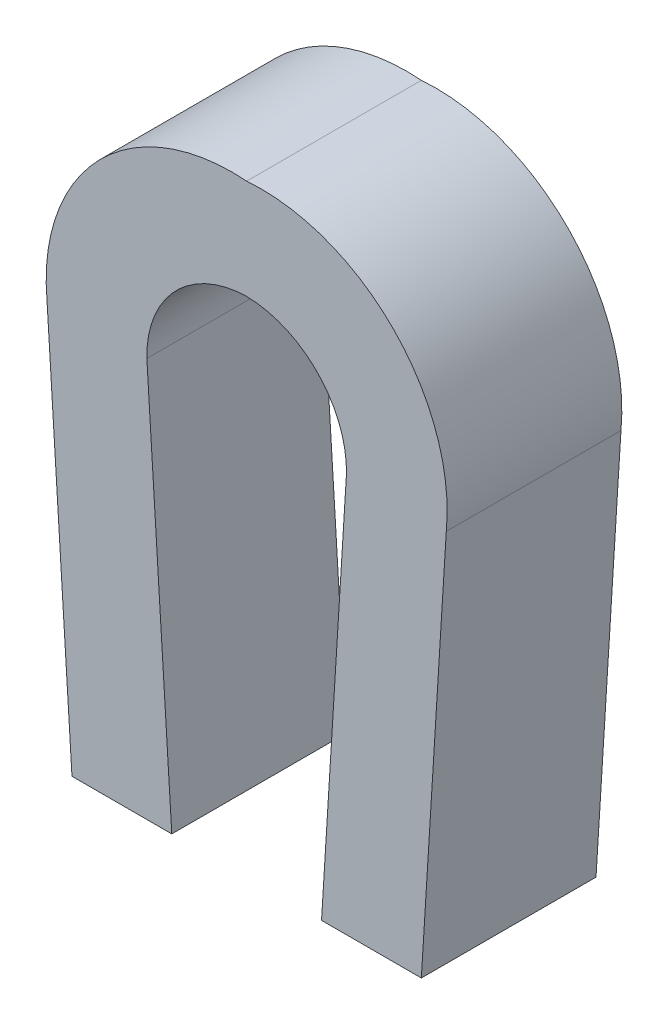
ISO-10303-21;
HEADER;
FILE_DESCRIPTION(('STEP AP214'),'2;1');
FILE_NAME('part.step','',(''),(''),'','','');
FILE_SCHEMA(('AUTOMOTIVE_DESIGN { 1 0 10303 214 1 1 1 1 }'));
ENDSEC;
DATA;
#1=APPLICATION_CONTEXT('core data for automotive mechanical design processes');
#2=APPLICATION_PROTOCOL_DEFINITION('international standard','automotive_design',2000,#1);
#3=PRODUCT_CONTEXT('',#1,'mechanical');
#4=PRODUCT('Part','Part','',(#3));
#5=PRODUCT_RELATED_PRODUCT_CATEGORY('part','',(#4));
#6=PRODUCT_DEFINITION_FORMATION('','',#4);
#7=PRODUCT_DEFINITION_CONTEXT('part definition',#1,'design');
#8=PRODUCT_DEFINITION('design','',#6,#7);
#9=PRODUCT_DEFINITION_SHAPE('','',#8);
#10=(LENGTH_UNIT() NAMED_UNIT(*) SI_UNIT(.MILLI.,.METRE.));
#11=(NAMED_UNIT(*) PLANE_ANGLE_UNIT() SI_UNIT($,.RADIAN.));
#12=(NAMED_UNIT(*) SI_UNIT($,.STERADIAN.) SOLID_ANGLE_UNIT());
#13=UNCERTAINTY_MEASURE_WITH_UNIT(LENGTH_MEASURE(1.E-05),#10,'distance_accuracy_value','');
#14=(GEOMETRIC_REPRESENTATION_CONTEXT(3) GLOBAL_UNCERTAINTY_ASSIGNED_CONTEXT((#13)) GLOBAL_UNIT_ASSIGNED_CONTEXT((#10,
#11,#12)) REPRESENTATION_CONTEXT('',''));
#15=CARTESIAN_POINT('',(0.,0.,0.));
#16=DIRECTION('',(0.,0.,1.));
#17=DIRECTION('',(1.,0.,0.));
#18=AXIS2_PLACEMENT_3D('',#15,#16,#17);
#19=CARTESIAN_POINT('',(0.0360134835005064,4.04110421672633,3.5));
#20=DIRECTION('',(0.,0.,-1.));
#21=DIRECTION('',(-1.,0.,0.));
#22=AXIS2_PLACEMENT_3D('',#19,#20,#21);
#23=CYLINDRICAL_SURFACE('',#22,2.03642835907099);
#24=CARTESIAN_POINT('',(0.0360134835005064,4.04110421672633,0.));
#25=DIRECTION('',(0.,0.,-1.));
#26=DIRECTION('',(-1.,0.,0.));
#27=AXIS2_PLACEMENT_3D('',#24,#25,#26);
#28=CIRCLE('',#27,2.03642835907099);
#29=CARTESIAN_POINT('',(-2.,4.,0.));
#30=VERTEX_POINT('',#29);
#31=CARTESIAN_POINT('',(0.,6.07721410831733,0.));
#32=VERTEX_POINT('',#31);
#33=EDGE_CURVE('E141',#30,#32,#28,.T.);
#34=ORIENTED_EDGE('',*,*,#33,.T.);
#35=DIRECTION('',(0.,0.,-1.));
#36=VECTOR('',#35,1.);
#37=CARTESIAN_POINT('',(0.,6.07721410831733,3.5));
#38=LINE('',#37,#36);
#39=CARTESIAN_POINT('',(0.,6.07721410831733,3.5));
#40=VERTEX_POINT('',#39);
#41=EDGE_CURVE('E11',#40,#32,#38,.T.);
#42=ORIENTED_EDGE('',*,*,#41,.F.);
#43=CARTESIAN_POINT('',(0.0360134835005064,4.04110421672633,3.5));
#44=DIRECTION('',(0.,0.,-1.));
#45=DIRECTION('',(-1.,0.,0.));
#46=AXIS2_PLACEMENT_3D('',#43,#44,#45);
#47=CIRCLE('',#46,2.03642835907099);
#48=CARTESIAN_POINT('',(-2.,4.,3.5));
#49=VERTEX_POINT('',#48);
#50=EDGE_CURVE('E159',#49,#40,#47,.T.);
#51=ORIENTED_EDGE('',*,*,#50,.F.);
#52=DIRECTION('',(0.,0.,-1.));
#53=VECTOR('',#52,1.);
#54=CARTESIAN_POINT('',(-2.,4.,3.5));
#55=LINE('',#54,#53);
#56=EDGE_CURVE('E137',#49,#30,#55,.T.);
#57=ORIENTED_EDGE('',*,*,#56,.T.);
#58=EDGE_LOOP('',(#34,#42,#51,#57));
#59=FACE_BOUND('',#58,.T.);
#60=ADVANCED_FACE('F33',(#59),#23,.F.);
#61=CARTESIAN_POINT('',(-0.0360134835005055,4.04110421672633,3.5));
#62=DIRECTION('',(0.,0.,-1.));
#63=DIRECTION('',(-1.,0.,0.));
#64=AXIS2_PLACEMENT_3D('',#61,#62,#63);
#65=CYLINDRICAL_SURFACE('',#64,2.03642835907099);
#66=CARTESIAN_POINT('',(-0.0360134835005055,4.04110421672633,0.));
#67=DIRECTION('',(0.,0.,-1.));
#68=DIRECTION('',(1.,0.,0.));
#69=AXIS2_PLACEMENT_3D('',#66,#67,#68);
#70=CIRCLE('',#69,2.03642835907099);
#71=CARTESIAN_POINT('',(2.,4.,0.));
#72=VERTEX_POINT('',#71);
#73=EDGE_CURVE('E144',#32,#72,#70,.T.);
#74=ORIENTED_EDGE('',*,*,#73,.T.);
#75=DIRECTION('',(0.,0.,-1.));
#76=VECTOR('',#75,1.);
#77=CARTESIAN_POINT('',(2.,4.,3.5));
#78=LINE('',#77,#76);
#79=CARTESIAN_POINT('',(2.,4.,3.5));
#80=VERTEX_POINT('',#79);
#81=EDGE_CURVE('E41',#80,#72,#78,.T.);
#82=ORIENTED_EDGE('',*,*,#81,.F.);
#83=CARTESIAN_POINT('',(-0.0360134835005055,4.04110421672633,3.5));
#84=DIRECTION('',(0.,0.,-1.));
#85=DIRECTION('',(1.,0.,0.));
#86=AXIS2_PLACEMENT_3D('',#83,#84,#85);
#87=CIRCLE('',#86,2.03642835907099);
#88=EDGE_CURVE('E98',#40,#80,#87,.T.);
#89=ORIENTED_EDGE('',*,*,#88,.F.);
#90=ORIENTED_EDGE('',*,*,#41,.T.);
#91=EDGE_LOOP('',(#74,#82,#89,#90));
#92=FACE_BOUND('',#91,.T.);
#93=ADVANCED_FACE('F208',(#92),#65,.F.);
#94=CARTESIAN_POINT('',(2.,4.,3.5));
#95=DIRECTION('',(0.998052578482889,-0.0623782861551804,0.));
#96=DIRECTION('',(0.0623782861551804,0.998052578482889,0.));
#97=AXIS2_PLACEMENT_3D('',#94,#95,#96);
#98=PLANE('',#97);
#99=DIRECTION('',(-0.0623782861551804,-0.998052578482889,0.));
#100=VECTOR('',#99,1.);
#101=CARTESIAN_POINT('',(2.,4.,0.));
#102=LINE('',#101,#100);
#103=CARTESIAN_POINT('',(1.5,-4.,0.));
#104=VERTEX_POINT('',#103);
#105=EDGE_CURVE('E146',#72,#104,#102,.T.);
#106=ORIENTED_EDGE('',*,*,#105,.T.);
#107=DIRECTION('',(0.,0.,-1.));
#108=VECTOR('',#107,1.);
#109=CARTESIAN_POINT('',(1.5,-4.,3.5));
#110=LINE('',#109,#108);
#111=CARTESIAN_POINT('',(1.5,-4.,3.5));
#112=VERTEX_POINT('',#111);
#113=EDGE_CURVE('E172',#112,#104,#110,.T.);
#114=ORIENTED_EDGE('',*,*,#113,.F.);
#115=DIRECTION('',(-0.0623782861551804,-0.998052578482889,0.));
#116=VECTOR('',#115,1.);
#117=CARTESIAN_POINT('',(2.,4.,3.5));
#118=LINE('',#117,#116);
#119=EDGE_CURVE('E180',#80,#112,#118,.T.);
#120=ORIENTED_EDGE('',*,*,#119,.F.);
#121=ORIENTED_EDGE('',*,*,#81,.T.);
#122=EDGE_LOOP('',(#106,#114,#120,#121));
#123=FACE_BOUND('',#122,.T.);
#124=ADVANCED_FACE('F178',(#123),#98,.F.);
#125=CARTESIAN_POINT('',(1.5,-4.,3.5));
#126=DIRECTION('',(0.,1.,0.));
#127=DIRECTION('',(-1.,0.,0.));
#128=AXIS2_PLACEMENT_3D('',#125,#126,#127);
#129=PLANE('',#128);
#130=DIRECTION('',(1.,0.,0.));
#131=VECTOR('',#130,1.);
#132=CARTESIAN_POINT('',(1.5,-4.,0.));
#133=LINE('',#132,#131);
#134=CARTESIAN_POINT('',(3.5,-4.,0.));
#135=VERTEX_POINT('',#134);
#136=EDGE_CURVE('E148',#104,#135,#133,.T.);
#137=ORIENTED_EDGE('',*,*,#136,.T.);
#138=DIRECTION('',(0.,0.,-1.));
#139=VECTOR('',#138,1.);
#140=CARTESIAN_POINT('',(3.5,-4.,3.5));
#141=LINE('',#140,#139);
#142=CARTESIAN_POINT('',(3.5,-4.,3.5));
#143=VERTEX_POINT('',#142);
#144=EDGE_CURVE('E169',#143,#135,#141,.T.);
#145=ORIENTED_EDGE('',*,*,#144,.F.);
#146=DIRECTION('',(1.,0.,0.));
#147=VECTOR('',#146,1.);
#148=CARTESIAN_POINT('',(1.5,-4.,3.5));
#149=LINE('',#148,#147);
#150=EDGE_CURVE('E198',#112,#143,#149,.T.);
#151=ORIENTED_EDGE('',*,*,#150,.F.);
#152=ORIENTED_EDGE('',*,*,#113,.T.);
#153=EDGE_LOOP('',(#137,#145,#151,#152));
#154=FACE_BOUND('',#153,.T.);
#155=ADVANCED_FACE('F189',(#154),#129,.F.);
#156=CARTESIAN_POINT('',(3.5,-4.,3.5));
#157=DIRECTION('',(-0.998052578482889,0.0623782861551807,0.));
#158=DIRECTION('',(-0.0623782861551807,-0.998052578482889,0.));
#159=AXIS2_PLACEMENT_3D('',#156,#157,#158);
#160=PLANE('',#159);
#161=DIRECTION('',(0.0623782861551807,0.998052578482889,0.));
#162=VECTOR('',#161,1.);
#163=CARTESIAN_POINT('',(3.5,-4.,0.));
#164=LINE('',#163,#162);
#165=CARTESIAN_POINT('',(4.,4.,0.));
#166=VERTEX_POINT('',#165);
#167=EDGE_CURVE('E150',#135,#166,#164,.T.);
#168=ORIENTED_EDGE('',*,*,#167,.T.);
#169=DIRECTION('',(0.,0.,-1.));
#170=VECTOR('',#169,1.);
#171=CARTESIAN_POINT('',(4.,4.,3.5));
#172=LINE('',#171,#170);
#173=CARTESIAN_POINT('',(4.,4.,3.5));
#174=VERTEX_POINT('',#173);
#175=EDGE_CURVE('E166',#174,#166,#172,.T.);
#176=ORIENTED_EDGE('',*,*,#175,.F.);
#177=DIRECTION('',(0.0623782861551807,0.998052578482889,0.));
#178=VECTOR('',#177,1.);
#179=CARTESIAN_POINT('',(3.5,-4.,3.5));
#180=LINE('',#179,#178);
#181=EDGE_CURVE('E195',#143,#174,#180,.T.);
#182=ORIENTED_EDGE('',*,*,#181,.F.);
#183=ORIENTED_EDGE('',*,*,#144,.T.);
#184=EDGE_LOOP('',(#168,#176,#182,#183));
#185=FACE_BOUND('',#184,.T.);
#186=ADVANCED_FACE('F193',(#185),#160,.F.);
#187=CARTESIAN_POINT('',(0.288890432809215,4.35990240757147,3.5));
#188=DIRECTION('',(0.,0.,-1.));
#189=DIRECTION('',(-1.,0.,0.));
#190=AXIS2_PLACEMENT_3D('',#187,#188,#189);
#191=CYLINDRICAL_SURFACE('',#190,3.72852034494526);
#192=CARTESIAN_POINT('',(0.288890432809215,4.35990240757147,0.));
#193=DIRECTION('',(0.,0.,1.));
#194=DIRECTION('',(1.,0.,0.));
#195=AXIS2_PLACEMENT_3D('',#192,#193,#194);
#196=CIRCLE('',#195,3.72852034494526);
#197=CARTESIAN_POINT('',(0.,8.07721410831733,0.));
#198=VERTEX_POINT('',#197);
#199=EDGE_CURVE('E152',#166,#198,#196,.T.);
#200=ORIENTED_EDGE('',*,*,#199,.T.);
#201=DIRECTION('',(0.,0.,-1.));
#202=VECTOR('',#201,1.);
#203=CARTESIAN_POINT('',(0.,8.07721410831733,3.5));
#204=LINE('',#203,#202);
#205=CARTESIAN_POINT('',(0.,8.07721410831733,3.5));
#206=VERTEX_POINT('',#205);
#207=EDGE_CURVE('E163',#206,#198,#204,.T.);
#208=ORIENTED_EDGE('',*,*,#207,.F.);
#209=CARTESIAN_POINT('',(0.288890432809215,4.35990240757147,3.5));
#210=DIRECTION('',(0.,0.,1.));
#211=DIRECTION('',(1.,0.,0.));
#212=AXIS2_PLACEMENT_3D('',#209,#210,#211);
#213=CIRCLE('',#212,3.72852034494526);
#214=EDGE_CURVE('E197',#174,#206,#213,.T.);
#215=ORIENTED_EDGE('',*,*,#214,.F.);
#216=ORIENTED_EDGE('',*,*,#175,.T.);
#217=EDGE_LOOP('',(#200,#208,#215,#216));
#218=FACE_BOUND('',#217,.T.);
#219=ADVANCED_FACE('F220',(#218),#191,.T.);
#220=CARTESIAN_POINT('',(-0.288890432809214,4.35990240757147,3.5));
#221=DIRECTION('',(0.,0.,-1.));
#222=DIRECTION('',(-1.,0.,0.));
#223=AXIS2_PLACEMENT_3D('',#220,#221,#222);
#224=CYLINDRICAL_SURFACE('',#223,3.72852034494526);
#225=CARTESIAN_POINT('',(-0.288890432809214,4.35990240757147,0.));
#226=DIRECTION('',(0.,0.,1.));
#227=DIRECTION('',(-1.,0.,0.));
#228=AXIS2_PLACEMENT_3D('',#225,#226,#227);
#229=CIRCLE('',#228,3.72852034494526);
#230=CARTESIAN_POINT('',(-4.,4.,0.));
#231=VERTEX_POINT('',#230);
#232=EDGE_CURVE('E154',#198,#231,#229,.T.);
#233=ORIENTED_EDGE('',*,*,#232,.T.);
#234=DIRECTION('',(0.,0.,-1.));
#235=VECTOR('',#234,1.);
#236=CARTESIAN_POINT('',(-4.,4.,3.5));
#237=LINE('',#236,#235);
#238=CARTESIAN_POINT('',(-4.,4.,3.5));
#239=VERTEX_POINT('',#238);
#240=EDGE_CURVE('E132',#239,#231,#237,.T.);
#241=ORIENTED_EDGE('',*,*,#240,.F.);
#242=CARTESIAN_POINT('',(-0.288890432809214,4.35990240757147,3.5));
#243=DIRECTION('',(0.,0.,1.));
#244=DIRECTION('',(-1.,0.,0.));
#245=AXIS2_PLACEMENT_3D('',#242,#243,#244);
#246=CIRCLE('',#245,3.72852034494526);
#247=EDGE_CURVE('E123',#206,#239,#246,.T.);
#248=ORIENTED_EDGE('',*,*,#247,.F.);
#249=ORIENTED_EDGE('',*,*,#207,.T.);
#250=EDGE_LOOP('',(#233,#241,#248,#249));
#251=FACE_BOUND('',#250,.T.);
#252=ADVANCED_FACE('F223',(#251),#224,.T.);
#253=CARTESIAN_POINT('',(-3.5,-4.,3.5));
#254=DIRECTION('',(0.998052578482889,0.0623782861551808,0.));
#255=DIRECTION('',(-0.0623782861551808,0.998052578482889,0.));
#256=AXIS2_PLACEMENT_3D('',#253,#254,#255);
#257=PLANE('',#256);
#258=DIRECTION('',(0.0623782861551808,-0.998052578482889,0.));
#259=VECTOR('',#258,1.);
#260=CARTESIAN_POINT('',(-3.5,-4.,0.));
#261=LINE('',#260,#259);
#262=CARTESIAN_POINT('',(-3.5,-4.,0.));
#263=VERTEX_POINT('',#262);
#264=EDGE_CURVE('E131',#231,#263,#261,.T.);
#265=ORIENTED_EDGE('',*,*,#264,.T.);
#266=DIRECTION('',(0.,0.,-1.));
#267=VECTOR('',#266,1.);
#268=CARTESIAN_POINT('',(-3.5,-4.,3.5));
#269=LINE('',#268,#267);
#270=CARTESIAN_POINT('',(-3.5,-4.,3.5));
#271=VERTEX_POINT('',#270);
#272=EDGE_CURVE('E128',#271,#263,#269,.T.);
#273=ORIENTED_EDGE('',*,*,#272,.F.);
#274=DIRECTION('',(0.0623782861551808,-0.998052578482889,0.));
#275=VECTOR('',#274,1.);
#276=CARTESIAN_POINT('',(-3.5,-4.,3.5));
#277=LINE('',#276,#275);
#278=EDGE_CURVE('E117',#239,#271,#277,.T.);
#279=ORIENTED_EDGE('',*,*,#278,.F.);
#280=ORIENTED_EDGE('',*,*,#240,.T.);
#281=EDGE_LOOP('',(#265,#273,#279,#280));
#282=FACE_BOUND('',#281,.T.);
#283=ADVANCED_FACE('F129',(#282),#257,.F.);
#284=CARTESIAN_POINT('',(-1.5,-4.,3.5));
#285=DIRECTION('',(0.,1.,0.));
#286=DIRECTION('',(-1.,0.,0.));
#287=AXIS2_PLACEMENT_3D('',#284,#285,#286);
#288=PLANE('',#287);
#289=DIRECTION('',(1.,0.,0.));
#290=VECTOR('',#289,1.);
#291=CARTESIAN_POINT('',(-1.5,-4.,0.));
#292=LINE('',#291,#290);
#293=CARTESIAN_POINT('',(-1.5,-4.,0.));
#294=VERTEX_POINT('',#293);
#295=EDGE_CURVE('E84',#263,#294,#292,.T.);
#296=ORIENTED_EDGE('',*,*,#295,.T.);
#297=DIRECTION('',(0.,0.,-1.));
#298=VECTOR('',#297,1.);
#299=CARTESIAN_POINT('',(-1.5,-4.,3.5));
#300=LINE('',#299,#298);
#301=CARTESIAN_POINT('',(-1.5,-4.,3.5));
#302=VERTEX_POINT('',#301);
#303=EDGE_CURVE('E133',#302,#294,#300,.T.);
#304=ORIENTED_EDGE('',*,*,#303,.F.);
#305=DIRECTION('',(1.,0.,0.));
#306=VECTOR('',#305,1.);
#307=CARTESIAN_POINT('',(-1.5,-4.,3.5));
#308=LINE('',#307,#306);
#309=EDGE_CURVE('E121',#271,#302,#308,.T.);
#310=ORIENTED_EDGE('',*,*,#309,.F.);
#311=ORIENTED_EDGE('',*,*,#272,.T.);
#312=EDGE_LOOP('',(#296,#304,#310,#311));
#313=FACE_BOUND('',#312,.T.);
#314=ADVANCED_FACE('F135',(#313),#288,.F.);
#315=CARTESIAN_POINT('',(-2.,4.,3.5));
#316=DIRECTION('',(-0.998052578482889,-0.0623782861551807,0.));
#317=DIRECTION('',(0.0623782861551807,-0.998052578482889,0.));
#318=AXIS2_PLACEMENT_3D('',#315,#316,#317);
#319=PLANE('',#318);
#320=DIRECTION('',(-0.0623782861551807,0.998052578482889,0.));
#321=VECTOR('',#320,1.);
#322=CARTESIAN_POINT('',(-2.,4.,0.));
#323=LINE('',#322,#321);
#324=EDGE_CURVE('E90',#294,#30,#323,.T.);
#325=ORIENTED_EDGE('',*,*,#324,.T.);
#326=ORIENTED_EDGE('',*,*,#56,.F.);
#327=DIRECTION('',(-0.0623782861551807,0.998052578482889,0.));
#328=VECTOR('',#327,1.);
#329=CARTESIAN_POINT('',(-2.,4.,3.5));
#330=LINE('',#329,#328);
#331=EDGE_CURVE('E49',#302,#49,#330,.T.);
#332=ORIENTED_EDGE('',*,*,#331,.F.);
#333=ORIENTED_EDGE('',*,*,#303,.T.);
#334=EDGE_LOOP('',(#325,#326,#332,#333));
#335=FACE_BOUND('',#334,.T.);
#336=ADVANCED_FACE('F232',(#335),#319,.F.);
#337=CARTESIAN_POINT('',(0.0360134835005064,4.04110421672633,3.5));
#338=DIRECTION('',(0.,0.,-1.));
#339=DIRECTION('',(-1.,0.,0.));
#340=AXIS2_PLACEMENT_3D('',#337,#338,#339);
#341=PLANE('',#340);
#342=ORIENTED_EDGE('',*,*,#50,.T.);
#343=ORIENTED_EDGE('',*,*,#88,.T.);
#344=ORIENTED_EDGE('',*,*,#119,.T.);
#345=ORIENTED_EDGE('',*,*,#150,.T.);
#346=ORIENTED_EDGE('',*,*,#181,.T.);
#347=ORIENTED_EDGE('',*,*,#214,.T.);
#348=ORIENTED_EDGE('',*,*,#247,.T.);
#349=ORIENTED_EDGE('',*,*,#278,.T.);
#350=ORIENTED_EDGE('',*,*,#309,.T.);
#351=ORIENTED_EDGE('',*,*,#331,.T.);
#352=EDGE_LOOP('',(#342,#343,#344,#345,#346,#347,#348,#349,#350,#351));
#353=FACE_BOUND('',#352,.T.);
#354=ADVANCED_FACE('F119',(#353),#341,.F.);
#355=CARTESIAN_POINT('',(0.0360134835005064,4.04110421672633,0.));
#356=DIRECTION('',(0.,0.,-1.));
#357=DIRECTION('',(-1.,0.,0.));
#358=AXIS2_PLACEMENT_3D('',#355,#356,#357);
#359=PLANE('',#358);
#360=ORIENTED_EDGE('',*,*,#33,.F.);
#361=ORIENTED_EDGE('',*,*,#324,.F.);
#362=ORIENTED_EDGE('',*,*,#295,.F.);
#363=ORIENTED_EDGE('',*,*,#264,.F.);
#364=ORIENTED_EDGE('',*,*,#232,.F.);
#365=ORIENTED_EDGE('',*,*,#199,.F.);
#366=ORIENTED_EDGE('',*,*,#167,.F.);
#367=ORIENTED_EDGE('',*,*,#136,.F.);
#368=ORIENTED_EDGE('',*,*,#105,.F.);
#369=ORIENTED_EDGE('',*,*,#73,.F.);
#370=EDGE_LOOP('',(#360,#361,#362,#363,#364,#365,#366,#367,#368,#369));
#371=FACE_BOUND('',#370,.T.);
#372=ADVANCED_FACE('F184',(#371),#359,.T.);
#373=CLOSED_SHELL('',(#60,#93,#124,#155,#186,#219,#252,#283,#314,#336,#354,#372));
#374=MANIFOLD_SOLID_BREP('B2',#373);
#375=ADVANCED_BREP_SHAPE_REPRESENTATION('',(#18,#374),#14);
#376=SHAPE_DEFINITION_REPRESENTATION(#9,#375);
ENDSEC;
END-ISO-10303-21;
